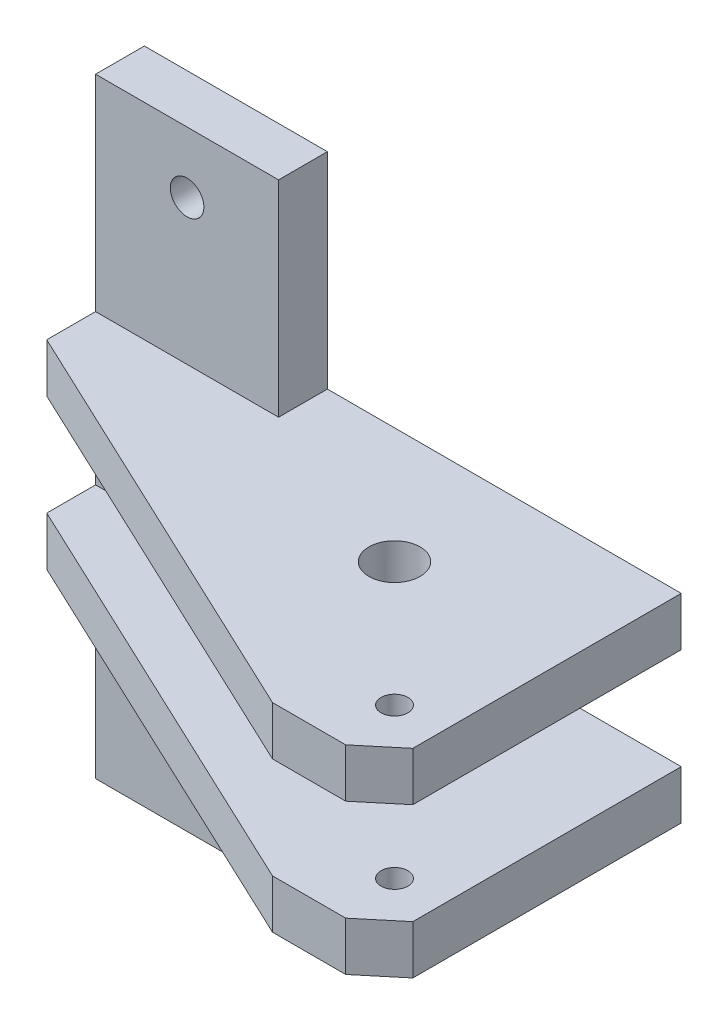
ISO-10303-21;
HEADER;
FILE_DESCRIPTION(('STEP AP214'),'2;1');
FILE_NAME('part.step','',(''),(''),'','','');
FILE_SCHEMA(('AUTOMOTIVE_DESIGN { 1 0 10303 214 1 1 1 1 }'));
ENDSEC;
DATA;
#1=APPLICATION_CONTEXT('core data for automotive mechanical design processes');
#2=APPLICATION_PROTOCOL_DEFINITION('international standard','automotive_design',2000,#1);
#3=PRODUCT_CONTEXT('',#1,'mechanical');
#4=PRODUCT('Part','Part','',(#3));
#5=PRODUCT_RELATED_PRODUCT_CATEGORY('part','',(#4));
#6=PRODUCT_DEFINITION_FORMATION('','',#4);
#7=PRODUCT_DEFINITION_CONTEXT('part definition',#1,'design');
#8=PRODUCT_DEFINITION('design','',#6,#7);
#9=PRODUCT_DEFINITION_SHAPE('','',#8);
#10=(LENGTH_UNIT() NAMED_UNIT(*) SI_UNIT(.MILLI.,.METRE.));
#11=(NAMED_UNIT(*) PLANE_ANGLE_UNIT() SI_UNIT($,.RADIAN.));
#12=(NAMED_UNIT(*) SI_UNIT($,.STERADIAN.) SOLID_ANGLE_UNIT());
#13=UNCERTAINTY_MEASURE_WITH_UNIT(LENGTH_MEASURE(1.E-05),#10,'distance_accuracy_value','');
#14=(GEOMETRIC_REPRESENTATION_CONTEXT(3) GLOBAL_UNCERTAINTY_ASSIGNED_CONTEXT((#13)) GLOBAL_UNIT_ASSIGNED_CONTEXT((#10,
#11,#12)) REPRESENTATION_CONTEXT('',''));
#15=CARTESIAN_POINT('',(0.,0.,0.));
#16=DIRECTION('',(0.,0.,1.));
#17=DIRECTION('',(1.,0.,0.));
#18=AXIS2_PLACEMENT_3D('',#15,#16,#17);
#19=CARTESIAN_POINT('',(30.,-8.3,19.));
#20=DIRECTION('',(0.,1.,0.));
#21=DIRECTION('',(0.,0.,1.));
#22=AXIS2_PLACEMENT_3D('',#19,#20,#21);
#23=CYLINDRICAL_SURFACE('',#22,5.5);
#24=CARTESIAN_POINT('',(30.,-8.3,19.));
#25=DIRECTION('',(0.,1.,0.));
#26=DIRECTION('',(0.,0.,1.));
#27=AXIS2_PLACEMENT_3D('',#24,#25,#26);
#28=CIRCLE('',#27,5.5);
#29=CARTESIAN_POINT('',(30.,-8.3,24.5));
#30=VERTEX_POINT('',#29);
#31=EDGE_CURVE('E291',#30,#30,#28,.T.);
#32=CARTESIAN_POINT('',(30.,-7.5,19.));
#33=DIRECTION('',(0.,1.,0.));
#34=DIRECTION('',(0.,0.,1.));
#35=AXIS2_PLACEMENT_3D('',#32,#33,#34);
#36=CIRCLE('',#35,5.5);
#37=CARTESIAN_POINT('',(30.,-7.5,24.5));
#38=VERTEX_POINT('',#37);
#39=EDGE_CURVE('E288',#38,#38,#36,.T.);
#40=CARTESIAN_POINT('',(30.,-8.3,24.5));
#41=CARTESIAN_POINT('',(30.,-8.29166666666667,24.5));
#42=CARTESIAN_POINT('',(30.,-8.28333333333333,24.5));
#43=CARTESIAN_POINT('',(30.,-8.26666666666667,24.5));
#44=CARTESIAN_POINT('',(30.,-8.25833333333333,24.5));
#45=CARTESIAN_POINT('',(30.,-8.24166666666667,24.5));
#46=CARTESIAN_POINT('',(30.,-8.23333333333333,24.5));
#47=CARTESIAN_POINT('',(30.,-8.21666666666667,24.5));
#48=CARTESIAN_POINT('',(30.,-8.20833333333334,24.5));
#49=CARTESIAN_POINT('',(30.,-8.19166666666667,24.5));
#50=CARTESIAN_POINT('',(30.,-8.18333333333333,24.5));
#51=CARTESIAN_POINT('',(30.,-8.16666666666667,24.5));
#52=CARTESIAN_POINT('',(30.,-8.15833333333333,24.5));
#53=CARTESIAN_POINT('',(30.,-8.14166666666667,24.5));
#54=CARTESIAN_POINT('',(30.,-8.13333333333333,24.5));
#55=CARTESIAN_POINT('',(30.,-8.11666666666667,24.5));
#56=CARTESIAN_POINT('',(30.,-8.10833333333333,24.5));
#57=CARTESIAN_POINT('',(30.,-8.09166666666667,24.5));
#58=CARTESIAN_POINT('',(30.,-8.08333333333333,24.5));
#59=CARTESIAN_POINT('',(30.,-8.06666666666667,24.5));
#60=CARTESIAN_POINT('',(30.,-8.05833333333333,24.5));
#61=CARTESIAN_POINT('',(30.,-8.04166666666667,24.5));
#62=CARTESIAN_POINT('',(30.,-8.03333333333333,24.5));
#63=CARTESIAN_POINT('',(30.,-8.01666666666667,24.5));
#64=CARTESIAN_POINT('',(30.,-8.00833333333333,24.5));
#65=CARTESIAN_POINT('',(30.,-7.99166666666667,24.5));
#66=CARTESIAN_POINT('',(30.,-7.98333333333333,24.5));
#67=CARTESIAN_POINT('',(30.,-7.96666666666667,24.5));
#68=CARTESIAN_POINT('',(30.,-7.95833333333333,24.5));
#69=CARTESIAN_POINT('',(30.,-7.94166666666667,24.5));
#70=CARTESIAN_POINT('',(30.,-7.93333333333333,24.5));
#71=CARTESIAN_POINT('',(30.,-7.91666666666667,24.5));
#72=CARTESIAN_POINT('',(30.,-7.90833333333333,24.5));
#73=CARTESIAN_POINT('',(30.,-7.89166666666667,24.5));
#74=CARTESIAN_POINT('',(30.,-7.88333333333333,24.5));
#75=CARTESIAN_POINT('',(30.,-7.86666666666667,24.5));
#76=CARTESIAN_POINT('',(30.,-7.85833333333333,24.5));
#77=CARTESIAN_POINT('',(30.,-7.84166666666667,24.5));
#78=CARTESIAN_POINT('',(30.,-7.83333333333333,24.5));
#79=CARTESIAN_POINT('',(30.,-7.81666666666667,24.5));
#80=CARTESIAN_POINT('',(30.,-7.80833333333333,24.5));
#81=CARTESIAN_POINT('',(30.,-7.79166666666667,24.5));
#82=CARTESIAN_POINT('',(30.,-7.78333333333333,24.5));
#83=CARTESIAN_POINT('',(30.,-7.76666666666667,24.5));
#84=CARTESIAN_POINT('',(30.,-7.75833333333333,24.5));
#85=CARTESIAN_POINT('',(30.,-7.74166666666667,24.5));
#86=CARTESIAN_POINT('',(30.,-7.73333333333333,24.5));
#87=CARTESIAN_POINT('',(30.,-7.71666666666667,24.5));
#88=CARTESIAN_POINT('',(30.,-7.70833333333333,24.5));
#89=CARTESIAN_POINT('',(30.,-7.69166666666667,24.5));
#90=CARTESIAN_POINT('',(30.,-7.68333333333333,24.5));
#91=CARTESIAN_POINT('',(30.,-7.66666666666667,24.5));
#92=CARTESIAN_POINT('',(30.,-7.65833333333333,24.5));
#93=CARTESIAN_POINT('',(30.,-7.64166666666667,24.5));
#94=CARTESIAN_POINT('',(30.,-7.63333333333333,24.5));
#95=CARTESIAN_POINT('',(30.,-7.61666666666667,24.5));
#96=CARTESIAN_POINT('',(30.,-7.60833333333333,24.5));
#97=CARTESIAN_POINT('',(30.,-7.59166666666667,24.5));
#98=CARTESIAN_POINT('',(30.,-7.58333333333333,24.5));
#99=CARTESIAN_POINT('',(30.,-7.56666666666667,24.5));
#100=CARTESIAN_POINT('',(30.,-7.55833333333333,24.5));
#101=CARTESIAN_POINT('',(30.,-7.54166666666667,24.5));
#102=CARTESIAN_POINT('',(30.,-7.53333333333333,24.5));
#103=CARTESIAN_POINT('',(30.,-7.51666666666667,24.5));
#104=CARTESIAN_POINT('',(30.,-7.50833333333333,24.5));
#105=CARTESIAN_POINT('',(30.,-7.5,24.5));
#106=B_SPLINE_CURVE_WITH_KNOTS('',3,(#40,#41,#42,#43,#44,#45,#46,#47,#48,#49,#50,#51,#52,#53,
#54,#55,#56,#57,#58,#59,#60,#61,#62,#63,#64,#65,#66,#67,#68,#69,#70,#71,#72,#73,#74,#75,#76,#77,
#78,#79,#80,#81,#82,#83,#84,#85,#86,#87,#88,#89,#90,#91,#92,#93,#94,#95,#96,#97,#98,#99,#100,
#101,#102,#103,#104,#105),.UNSPECIFIED.,.F.,.F.,(4,2,2,2,2,2,2,2,2,2,2,2,2,2,2,2,2,2,2,2,2,2,2,
2,2,2,2,2,2,2,2,2,4),(0.,0.024999999999999,0.0499999999999997,0.0749999999999987,
0.0999999999999994,0.124999999999998,0.149999999999999,0.175,0.199999999999999,0.225,
0.249999999999999,0.274999999999999,0.3,0.324999999999999,0.35,0.374999999999999,
0.399999999999999,0.425,0.449999999999999,0.475,0.5,0.524999999999999,0.549999999999999,
0.574999999999999,0.6,0.625,0.65,0.674999999999999,0.7,0.725,0.75,0.775,0.799999999999999),.UNSPECIFIED.);
#107=EDGE_CURVE('BSEAM39',#30,#38,#106,.T.);
#108=ORIENTED_EDGE('',*,*,#31,.T.);
#109=ORIENTED_EDGE('',*,*,#39,.F.);
#110=ORIENTED_EDGE('',*,*,#107,.T.);
#111=ORIENTED_EDGE('',*,*,#107,.F.);
#112=EDGE_LOOP('',(#108,#110,#109,#111));
#113=FACE_BOUND('',#112,.T.);
#114=ADVANCED_FACE('F39',(#113),#23,.T.);
#115=CARTESIAN_POINT('',(58.,-16.3,0.));
#116=DIRECTION('',(1.,0.,0.));
#117=DIRECTION('',(0.,0.,-1.));
#118=AXIS2_PLACEMENT_3D('',#115,#116,#117);
#119=PLANE('',#118);
#120=DIRECTION('',(0.,1.,0.));
#121=VECTOR('',#120,1.);
#122=CARTESIAN_POINT('',(58.,-16.3,44.));
#123=LINE('',#122,#121);
#124=CARTESIAN_POINT('',(58.,8.3,44.));
#125=VERTEX_POINT('',#124);
#126=CARTESIAN_POINT('',(58.,16.3,44.));
#127=VERTEX_POINT('',#126);
#128=EDGE_CURVE('E370',#125,#127,#123,.T.);
#129=ORIENTED_EDGE('',*,*,#128,.F.);
#130=DIRECTION('',(0.,0.,-1.));
#131=VECTOR('',#130,1.);
#132=CARTESIAN_POINT('',(58.,8.3,0.));
#133=LINE('',#132,#131);
#134=CARTESIAN_POINT('',(58.,8.3,0.));
#135=VERTEX_POINT('',#134);
#136=EDGE_CURVE('E317',#125,#135,#133,.T.);
#137=ORIENTED_EDGE('',*,*,#136,.T.);
#138=DIRECTION('',(0.,1.,0.));
#139=VECTOR('',#138,1.);
#140=CARTESIAN_POINT('',(58.,-16.3,0.));
#141=LINE('',#140,#139);
#142=CARTESIAN_POINT('',(58.,16.3,0.));
#143=VERTEX_POINT('',#142);
#144=EDGE_CURVE('E367',#135,#143,#141,.T.);
#145=ORIENTED_EDGE('',*,*,#144,.T.);
#146=DIRECTION('',(0.,0.,-1.));
#147=VECTOR('',#146,1.);
#148=CARTESIAN_POINT('',(58.,16.3,0.));
#149=LINE('',#148,#147);
#150=EDGE_CURVE('E360',#127,#143,#149,.T.);
#151=ORIENTED_EDGE('',*,*,#150,.F.);
#152=EDGE_LOOP('',(#129,#137,#145,#151));
#153=FACE_BOUND('',#152,.T.);
#154=ADVANCED_FACE('F407',(#153),#119,.T.);
#155=CARTESIAN_POINT('',(58.,-16.3,44.));
#156=DIRECTION('',(0.64018439966448,0.,0.768221279597376));
#157=DIRECTION('',(0.768221279597376,0.,-0.64018439966448));
#158=AXIS2_PLACEMENT_3D('',#155,#156,#157);
#159=PLANE('',#158);
#160=DIRECTION('',(0.,1.,0.));
#161=VECTOR('',#160,1.);
#162=CARTESIAN_POINT('',(52.,-16.3,49.));
#163=LINE('',#162,#161);
#164=CARTESIAN_POINT('',(52.,8.3,49.));
#165=VERTEX_POINT('',#164);
#166=CARTESIAN_POINT('',(52.,16.3,49.));
#167=VERTEX_POINT('',#166);
#168=EDGE_CURVE('E373',#165,#167,#163,.T.);
#169=ORIENTED_EDGE('',*,*,#168,.F.);
#170=DIRECTION('',(0.768221279597376,0.,-0.64018439966448));
#171=VECTOR('',#170,1.);
#172=CARTESIAN_POINT('',(58.,8.3,44.));
#173=LINE('',#172,#171);
#174=EDGE_CURVE('E314',#165,#125,#173,.T.);
#175=ORIENTED_EDGE('',*,*,#174,.T.);
#176=ORIENTED_EDGE('',*,*,#128,.T.);
#177=DIRECTION('',(0.768221279597376,0.,-0.64018439966448));
#178=VECTOR('',#177,1.);
#179=CARTESIAN_POINT('',(58.,16.3,44.));
#180=LINE('',#179,#178);
#181=EDGE_CURVE('E357',#167,#127,#180,.T.);
#182=ORIENTED_EDGE('',*,*,#181,.F.);
#183=EDGE_LOOP('',(#169,#175,#176,#182));
#184=FACE_BOUND('',#183,.T.);
#185=ADVANCED_FACE('F382',(#184),#159,.T.);
#186=CARTESIAN_POINT('',(52.,-16.3,49.));
#187=DIRECTION('',(0.,0.,1.));
#188=DIRECTION('',(1.,0.,0.));
#189=AXIS2_PLACEMENT_3D('',#186,#187,#188);
#190=PLANE('',#189);
#191=DIRECTION('',(0.,1.,0.));
#192=VECTOR('',#191,1.);
#193=CARTESIAN_POINT('',(40.,-16.3,49.));
#194=LINE('',#193,#192);
#195=CARTESIAN_POINT('',(40.,8.3,49.));
#196=VERTEX_POINT('',#195);
#197=CARTESIAN_POINT('',(40.,16.3,49.));
#198=VERTEX_POINT('',#197);
#199=EDGE_CURVE('E204',#196,#198,#194,.T.);
#200=ORIENTED_EDGE('',*,*,#199,.F.);
#201=DIRECTION('',(1.,0.,0.));
#202=VECTOR('',#201,1.);
#203=CARTESIAN_POINT('',(52.,8.3,49.));
#204=LINE('',#203,#202);
#205=EDGE_CURVE('E56',#196,#165,#204,.T.);
#206=ORIENTED_EDGE('',*,*,#205,.T.);
#207=ORIENTED_EDGE('',*,*,#168,.T.);
#208=DIRECTION('',(1.,0.,0.));
#209=VECTOR('',#208,1.);
#210=CARTESIAN_POINT('',(52.,16.3,49.));
#211=LINE('',#210,#209);
#212=EDGE_CURVE('E354',#198,#167,#211,.T.);
#213=ORIENTED_EDGE('',*,*,#212,.F.);
#214=EDGE_LOOP('',(#200,#206,#207,#213));
#215=FACE_BOUND('',#214,.T.);
#216=ADVANCED_FACE('F380',(#215),#190,.T.);
#217=CARTESIAN_POINT('',(40.,-16.3,49.));
#218=DIRECTION('',(-0.426419231698256,0.,0.9045256429963));
#219=DIRECTION('',(0.9045256429963,0.,0.426419231698256));
#220=AXIS2_PLACEMENT_3D('',#217,#218,#219);
#221=PLANE('',#220);
#222=DIRECTION('',(0.,1.,0.));
#223=VECTOR('',#222,1.);
#224=CARTESIAN_POINT('',(-30.,-16.3,16.));
#225=LINE('',#224,#223);
#226=CARTESIAN_POINT('',(-30.,8.3,16.));
#227=VERTEX_POINT('',#226);
#228=CARTESIAN_POINT('',(-30.,16.3,16.));
#229=VERTEX_POINT('',#228);
#230=EDGE_CURVE('E205',#227,#229,#225,.T.);
#231=ORIENTED_EDGE('',*,*,#230,.F.);
#232=DIRECTION('',(0.9045256429963,0.,0.426419231698256));
#233=VECTOR('',#232,1.);
#234=CARTESIAN_POINT('',(40.,8.3,49.));
#235=LINE('',#234,#233);
#236=EDGE_CURVE('E311',#227,#196,#235,.T.);
#237=ORIENTED_EDGE('',*,*,#236,.T.);
#238=ORIENTED_EDGE('',*,*,#199,.T.);
#239=DIRECTION('',(0.9045256429963,0.,0.426419231698256));
#240=VECTOR('',#239,1.);
#241=CARTESIAN_POINT('',(40.,16.3,49.));
#242=LINE('',#241,#240);
#243=EDGE_CURVE('E351',#229,#198,#242,.T.);
#244=ORIENTED_EDGE('',*,*,#243,.F.);
#245=EDGE_LOOP('',(#231,#237,#238,#244));
#246=FACE_BOUND('',#245,.T.);
#247=ADVANCED_FACE('F391',(#246),#221,.T.);
#248=CARTESIAN_POINT('',(0.,0.,8.));
#249=DIRECTION('',(0.,0.,-1.));
#250=DIRECTION('',(-1.,0.,0.));
#251=AXIS2_PLACEMENT_3D('',#248,#249,#250);
#252=PLANE('',#251);
#253=CARTESIAN_POINT('',(-15.,40.,8.));
#254=DIRECTION('',(0.,0.,1.));
#255=DIRECTION('',(1.,0.,0.));
#256=AXIS2_PLACEMENT_3D('',#253,#254,#255);
#257=CIRCLE('',#256,2.75);
#258=CARTESIAN_POINT('',(-12.25,40.,8.));
#259=VERTEX_POINT('',#258);
#260=EDGE_CURVE('E217',#259,#259,#257,.T.);
#261=ORIENTED_EDGE('',*,*,#260,.F.);
#262=EDGE_LOOP('',(#261));
#263=FACE_BOUND('',#262,.T.);
#264=DIRECTION('',(-1.,0.,0.));
#265=VECTOR('',#264,1.);
#266=CARTESIAN_POINT('',(0.,16.3,8.));
#267=LINE('',#266,#265);
#268=CARTESIAN_POINT('',(0.,16.3,8.));
#269=VERTEX_POINT('',#268);
#270=CARTESIAN_POINT('',(-30.,16.3,8.));
#271=VERTEX_POINT('',#270);
#272=EDGE_CURVE('E211',#269,#271,#267,.T.);
#273=ORIENTED_EDGE('',*,*,#272,.F.);
#274=DIRECTION('',(0.,1.,0.));
#275=VECTOR('',#274,1.);
#276=CARTESIAN_POINT('',(0.,-50.,8.));
#277=LINE('',#276,#275);
#278=CARTESIAN_POINT('',(0.,50.,8.));
#279=VERTEX_POINT('',#278);
#280=EDGE_CURVE('E234',#269,#279,#277,.T.);
#281=ORIENTED_EDGE('',*,*,#280,.T.);
#282=DIRECTION('',(-1.,0.,0.));
#283=VECTOR('',#282,1.);
#284=CARTESIAN_POINT('',(-30.,50.,8.));
#285=LINE('',#284,#283);
#286=CARTESIAN_POINT('',(-30.,50.,8.));
#287=VERTEX_POINT('',#286);
#288=EDGE_CURVE('E237',#279,#287,#285,.T.);
#289=ORIENTED_EDGE('',*,*,#288,.T.);
#290=DIRECTION('',(0.,-1.,0.));
#291=VECTOR('',#290,1.);
#292=CARTESIAN_POINT('',(-30.,-50.,8.));
#293=LINE('',#292,#291);
#294=EDGE_CURVE('E229',#287,#271,#293,.T.);
#295=ORIENTED_EDGE('',*,*,#294,.T.);
#296=EDGE_LOOP('',(#273,#281,#289,#295));
#297=FACE_BOUND('',#296,.T.);
#298=ADVANCED_FACE('F422',(#263,#297),#252,.F.);
#299=CARTESIAN_POINT('',(0.,-50.,8.));
#300=DIRECTION('',(-1.,0.,0.));
#301=DIRECTION('',(0.,0.,1.));
#302=AXIS2_PLACEMENT_3D('',#299,#300,#301);
#303=PLANE('',#302);
#304=DIRECTION('',(0.,0.,1.));
#305=VECTOR('',#304,1.);
#306=CARTESIAN_POINT('',(0.,16.3,8.));
#307=LINE('',#306,#305);
#308=CARTESIAN_POINT('',(0.,16.3,0.));
#309=VERTEX_POINT('',#308);
#310=EDGE_CURVE('E259',#309,#269,#307,.T.);
#311=ORIENTED_EDGE('',*,*,#310,.F.);
#312=DIRECTION('',(0.,1.,0.));
#313=VECTOR('',#312,1.);
#314=CARTESIAN_POINT('',(0.,-50.,0.));
#315=LINE('',#314,#313);
#316=CARTESIAN_POINT('',(0.,50.,0.));
#317=VERTEX_POINT('',#316);
#318=EDGE_CURVE('E243',#309,#317,#315,.T.);
#319=ORIENTED_EDGE('',*,*,#318,.T.);
#320=DIRECTION('',(0.,0.,-1.));
#321=VECTOR('',#320,1.);
#322=CARTESIAN_POINT('',(0.,50.,8.));
#323=LINE('',#322,#321);
#324=EDGE_CURVE('E250',#279,#317,#323,.T.);
#325=ORIENTED_EDGE('',*,*,#324,.F.);
#326=ORIENTED_EDGE('',*,*,#280,.F.);
#327=EDGE_LOOP('',(#311,#319,#325,#326));
#328=FACE_BOUND('',#327,.T.);
#329=ADVANCED_FACE('F410',(#328),#303,.F.);
#330=CARTESIAN_POINT('',(0.,-50.,8.));
#331=VERTEX_POINT('',#330);
#332=CARTESIAN_POINT('',(0.,-16.3,8.));
#333=VERTEX_POINT('',#332);
#334=EDGE_CURVE('E235',#331,#333,#277,.T.);
#335=ORIENTED_EDGE('',*,*,#334,.T.);
#336=DIRECTION('',(-1.,0.,0.));
#337=VECTOR('',#336,1.);
#338=CARTESIAN_POINT('',(0.,-16.3,8.));
#339=LINE('',#338,#337);
#340=CARTESIAN_POINT('',(-30.,-16.3,8.));
#341=VERTEX_POINT('',#340);
#342=EDGE_CURVE('E64',#333,#341,#339,.T.);
#343=ORIENTED_EDGE('',*,*,#342,.T.);
#344=CARTESIAN_POINT('',(-30.,-50.,8.));
#345=VERTEX_POINT('',#344);
#346=EDGE_CURVE('E232',#341,#345,#293,.T.);
#347=ORIENTED_EDGE('',*,*,#346,.T.);
#348=DIRECTION('',(1.,0.,0.));
#349=VECTOR('',#348,1.);
#350=CARTESIAN_POINT('',(-30.,-50.,8.));
#351=LINE('',#350,#349);
#352=EDGE_CURVE('E231',#345,#331,#351,.T.);
#353=ORIENTED_EDGE('',*,*,#352,.T.);
#354=EDGE_LOOP('',(#335,#343,#347,#353));
#355=FACE_BOUND('',#354,.T.);
#356=CARTESIAN_POINT('',(-15.,-40.,8.));
#357=DIRECTION('',(0.,0.,1.));
#358=DIRECTION('',(1.,0.,0.));
#359=AXIS2_PLACEMENT_3D('',#356,#357,#358);
#360=CIRCLE('',#359,2.75);
#361=CARTESIAN_POINT('',(-12.25,-40.,8.));
#362=VERTEX_POINT('',#361);
#363=EDGE_CURVE('E223',#362,#362,#360,.T.);
#364=ORIENTED_EDGE('',*,*,#363,.F.);
#365=EDGE_LOOP('',(#364));
#366=FACE_BOUND('',#365,.T.);
#367=ADVANCED_FACE('F426',(#355,#366),#252,.F.);
#368=CARTESIAN_POINT('',(0.,0.,0.));
#369=DIRECTION('',(0.,0.,-1.));
#370=DIRECTION('',(-1.,0.,0.));
#371=AXIS2_PLACEMENT_3D('',#368,#369,#370);
#372=PLANE('',#371);
#373=DIRECTION('',(-1.,0.,0.));
#374=VECTOR('',#373,1.);
#375=CARTESIAN_POINT('',(0.,-8.3,0.));
#376=LINE('',#375,#374);
#377=CARTESIAN_POINT('',(58.,-8.3,0.));
#378=VERTEX_POINT('',#377);
#379=CARTESIAN_POINT('',(0.,-8.3,0.));
#380=VERTEX_POINT('',#379);
#381=EDGE_CURVE('E302',#378,#380,#376,.T.);
#382=ORIENTED_EDGE('',*,*,#381,.F.);
#383=CARTESIAN_POINT('',(58.,-16.3,0.));
#384=VERTEX_POINT('',#383);
#385=EDGE_CURVE('E214',#384,#378,#141,.T.);
#386=ORIENTED_EDGE('',*,*,#385,.F.);
#387=DIRECTION('',(-1.,0.,0.));
#388=VECTOR('',#387,1.);
#389=CARTESIAN_POINT('',(-30.,-16.3,0.));
#390=LINE('',#389,#388);
#391=CARTESIAN_POINT('',(0.,-16.3,0.));
#392=VERTEX_POINT('',#391);
#393=EDGE_CURVE('E208',#384,#392,#390,.T.);
#394=ORIENTED_EDGE('',*,*,#393,.T.);
#395=CARTESIAN_POINT('',(0.,-50.,0.));
#396=VERTEX_POINT('',#395);
#397=EDGE_CURVE('E244',#396,#392,#315,.T.);
#398=ORIENTED_EDGE('',*,*,#397,.F.);
#399=DIRECTION('',(1.,0.,0.));
#400=VECTOR('',#399,1.);
#401=CARTESIAN_POINT('',(-30.,-50.,0.));
#402=LINE('',#401,#400);
#403=CARTESIAN_POINT('',(-30.,-50.,0.));
#404=VERTEX_POINT('',#403);
#405=EDGE_CURVE('E241',#404,#396,#402,.T.);
#406=ORIENTED_EDGE('',*,*,#405,.F.);
#407=DIRECTION('',(0.,-1.,0.));
#408=VECTOR('',#407,1.);
#409=CARTESIAN_POINT('',(-30.,-50.,0.));
#410=LINE('',#409,#408);
#411=CARTESIAN_POINT('',(-30.,50.,0.));
#412=VERTEX_POINT('',#411);
#413=EDGE_CURVE('E226',#412,#404,#410,.T.);
#414=ORIENTED_EDGE('',*,*,#413,.F.);
#415=DIRECTION('',(-1.,0.,0.));
#416=VECTOR('',#415,1.);
#417=CARTESIAN_POINT('',(-30.,50.,0.));
#418=LINE('',#417,#416);
#419=EDGE_CURVE('E246',#317,#412,#418,.T.);
#420=ORIENTED_EDGE('',*,*,#419,.F.);
#421=ORIENTED_EDGE('',*,*,#318,.F.);
#422=DIRECTION('',(-1.,0.,0.));
#423=VECTOR('',#422,1.);
#424=CARTESIAN_POINT('',(-30.,16.3,0.));
#425=LINE('',#424,#423);
#426=EDGE_CURVE('E336',#143,#309,#425,.T.);
#427=ORIENTED_EDGE('',*,*,#426,.F.);
#428=ORIENTED_EDGE('',*,*,#144,.F.);
#429=DIRECTION('',(-1.,0.,0.));
#430=VECTOR('',#429,1.);
#431=CARTESIAN_POINT('',(0.,8.3,0.));
#432=LINE('',#431,#430);
#433=CARTESIAN_POINT('',(0.,8.3,0.));
#434=VERTEX_POINT('',#433);
#435=EDGE_CURVE('E320',#135,#434,#432,.T.);
#436=ORIENTED_EDGE('',*,*,#435,.T.);
#437=DIRECTION('',(0.,1.,0.));
#438=VECTOR('',#437,1.);
#439=CARTESIAN_POINT('',(0.,-8.3,0.));
#440=LINE('',#439,#438);
#441=EDGE_CURVE('E308',#380,#434,#440,.T.);
#442=ORIENTED_EDGE('',*,*,#441,.F.);
#443=EDGE_LOOP('',(#382,#386,#394,#398,#406,#414,#420,#421,#427,#428,#436,#442));
#444=FACE_BOUND('',#443,.T.);
#445=CARTESIAN_POINT('',(-15.,-40.,0.));
#446=DIRECTION('',(0.,0.,1.));
#447=DIRECTION('',(1.,0.,0.));
#448=AXIS2_PLACEMENT_3D('',#445,#446,#447);
#449=CIRCLE('',#448,2.75);
#450=CARTESIAN_POINT('',(-12.25,-40.,0.));
#451=VERTEX_POINT('',#450);
#452=EDGE_CURVE('E220',#451,#451,#449,.T.);
#453=ORIENTED_EDGE('',*,*,#452,.T.);
#454=EDGE_LOOP('',(#453));
#455=FACE_BOUND('',#454,.T.);
#456=CARTESIAN_POINT('',(-15.,40.,0.));
#457=DIRECTION('',(0.,0.,1.));
#458=DIRECTION('',(1.,0.,0.));
#459=AXIS2_PLACEMENT_3D('',#456,#457,#458);
#460=CIRCLE('',#459,2.75);
#461=CARTESIAN_POINT('',(-12.25,40.,0.));
#462=VERTEX_POINT('',#461);
#463=EDGE_CURVE('E216',#462,#462,#460,.T.);
#464=ORIENTED_EDGE('',*,*,#463,.T.);
#465=EDGE_LOOP('',(#464));
#466=FACE_BOUND('',#465,.T.);
#467=ADVANCED_FACE('F402',(#444,#455,#466),#372,.T.);
#468=CARTESIAN_POINT('',(-30.,-50.,8.));
#469=DIRECTION('',(1.,0.,0.));
#470=DIRECTION('',(0.,0.,-1.));
#471=AXIS2_PLACEMENT_3D('',#468,#469,#470);
#472=PLANE('',#471);
#473=CARTESIAN_POINT('',(-30.,-16.3,16.));
#474=VERTEX_POINT('',#473);
#475=CARTESIAN_POINT('',(-30.,-8.3,16.));
#476=VERTEX_POINT('',#475);
#477=EDGE_CURVE('E197',#474,#476,#225,.T.);
#478=ORIENTED_EDGE('',*,*,#477,.T.);
#479=DIRECTION('',(0.,0.,1.));
#480=VECTOR('',#479,1.);
#481=CARTESIAN_POINT('',(-30.,-8.3,16.));
#482=LINE('',#481,#480);
#483=CARTESIAN_POINT('',(-30.,-8.3,8.));
#484=VERTEX_POINT('',#483);
#485=EDGE_CURVE('E179',#484,#476,#482,.T.);
#486=ORIENTED_EDGE('',*,*,#485,.F.);
#487=DIRECTION('',(0.,1.,0.));
#488=VECTOR('',#487,1.);
#489=CARTESIAN_POINT('',(-30.,-8.3,8.));
#490=LINE('',#489,#488);
#491=CARTESIAN_POINT('',(-30.,8.3,8.));
#492=VERTEX_POINT('',#491);
#493=EDGE_CURVE('E328',#484,#492,#490,.T.);
#494=ORIENTED_EDGE('',*,*,#493,.T.);
#495=DIRECTION('',(0.,0.,1.));
#496=VECTOR('',#495,1.);
#497=CARTESIAN_POINT('',(-30.,8.3,16.));
#498=LINE('',#497,#496);
#499=EDGE_CURVE('E295',#492,#227,#498,.T.);
#500=ORIENTED_EDGE('',*,*,#499,.T.);
#501=ORIENTED_EDGE('',*,*,#230,.T.);
#502=DIRECTION('',(0.,0.,1.));
#503=VECTOR('',#502,1.);
#504=CARTESIAN_POINT('',(-30.,16.3,16.));
#505=LINE('',#504,#503);
#506=EDGE_CURVE('E330',#271,#229,#505,.T.);
#507=ORIENTED_EDGE('',*,*,#506,.F.);
#508=ORIENTED_EDGE('',*,*,#294,.F.);
#509=DIRECTION('',(0.,0.,-1.));
#510=VECTOR('',#509,1.);
#511=CARTESIAN_POINT('',(-30.,50.,8.));
#512=LINE('',#511,#510);
#513=EDGE_CURVE('E239',#287,#412,#512,.T.);
#514=ORIENTED_EDGE('',*,*,#513,.T.);
#515=ORIENTED_EDGE('',*,*,#413,.T.);
#516=DIRECTION('',(0.,0.,-1.));
#517=VECTOR('',#516,1.);
#518=CARTESIAN_POINT('',(-30.,-50.,8.));
#519=LINE('',#518,#517);
#520=EDGE_CURVE('E256',#345,#404,#519,.T.);
#521=ORIENTED_EDGE('',*,*,#520,.F.);
#522=ORIENTED_EDGE('',*,*,#346,.F.);
#523=DIRECTION('',(0.,0.,1.));
#524=VECTOR('',#523,1.);
#525=CARTESIAN_POINT('',(-30.,-16.3,16.));
#526=LINE('',#525,#524);
#527=EDGE_CURVE('E203',#341,#474,#526,.T.);
#528=ORIENTED_EDGE('',*,*,#527,.T.);
#529=EDGE_LOOP('',(#478,#486,#494,#500,#501,#507,#508,#514,#515,#521,#522,#528));
#530=FACE_BOUND('',#529,.T.);
#531=ADVANCED_FACE('F41',(#530),#472,.F.);
#532=CARTESIAN_POINT('',(-30.,-50.,8.));
#533=DIRECTION('',(0.,1.,0.));
#534=DIRECTION('',(0.,0.,1.));
#535=AXIS2_PLACEMENT_3D('',#532,#533,#534);
#536=PLANE('',#535);
#537=ORIENTED_EDGE('',*,*,#405,.T.);
#538=DIRECTION('',(0.,0.,-1.));
#539=VECTOR('',#538,1.);
#540=CARTESIAN_POINT('',(0.,-50.,8.));
#541=LINE('',#540,#539);
#542=EDGE_CURVE('E253',#331,#396,#541,.T.);
#543=ORIENTED_EDGE('',*,*,#542,.F.);
#544=ORIENTED_EDGE('',*,*,#352,.F.);
#545=ORIENTED_EDGE('',*,*,#520,.T.);
#546=EDGE_LOOP('',(#537,#543,#544,#545));
#547=FACE_BOUND('',#546,.T.);
#548=ADVANCED_FACE('F513',(#547),#536,.F.);
#549=ORIENTED_EDGE('',*,*,#397,.T.);
#550=DIRECTION('',(0.,0.,1.));
#551=VECTOR('',#550,1.);
#552=CARTESIAN_POINT('',(0.,-16.3,8.));
#553=LINE('',#552,#551);
#554=EDGE_CURVE('E48',#392,#333,#553,.T.);
#555=ORIENTED_EDGE('',*,*,#554,.T.);
#556=ORIENTED_EDGE('',*,*,#334,.F.);
#557=ORIENTED_EDGE('',*,*,#542,.T.);
#558=EDGE_LOOP('',(#549,#555,#556,#557));
#559=FACE_BOUND('',#558,.T.);
#560=ADVANCED_FACE('F432',(#559),#303,.F.);
#561=CARTESIAN_POINT('',(-30.,50.,8.));
#562=DIRECTION('',(0.,-1.,0.));
#563=DIRECTION('',(0.,0.,-1.));
#564=AXIS2_PLACEMENT_3D('',#561,#562,#563);
#565=PLANE('',#564);
#566=ORIENTED_EDGE('',*,*,#419,.T.);
#567=ORIENTED_EDGE('',*,*,#513,.F.);
#568=ORIENTED_EDGE('',*,*,#288,.F.);
#569=ORIENTED_EDGE('',*,*,#324,.T.);
#570=EDGE_LOOP('',(#566,#567,#568,#569));
#571=FACE_BOUND('',#570,.T.);
#572=ADVANCED_FACE('F417',(#571),#565,.F.);
#573=CARTESIAN_POINT('',(-15.,-40.,8.));
#574=DIRECTION('',(0.,0.,-1.));
#575=DIRECTION('',(-1.,0.,0.));
#576=AXIS2_PLACEMENT_3D('',#573,#574,#575);
#577=CYLINDRICAL_SURFACE('',#576,2.75);
#578=ORIENTED_EDGE('',*,*,#363,.T.);
#579=EDGE_LOOP('',(#578));
#580=FACE_BOUND('',#579,.T.);
#581=ORIENTED_EDGE('',*,*,#452,.F.);
#582=EDGE_LOOP('',(#581));
#583=FACE_BOUND('',#582,.T.);
#584=ADVANCED_FACE('F495',(#580,#583),#577,.F.);
#585=CARTESIAN_POINT('',(-15.,40.,8.));
#586=DIRECTION('',(0.,0.,-1.));
#587=DIRECTION('',(-1.,0.,0.));
#588=AXIS2_PLACEMENT_3D('',#585,#586,#587);
#589=CYLINDRICAL_SURFACE('',#588,2.75);
#590=ORIENTED_EDGE('',*,*,#260,.T.);
#591=EDGE_LOOP('',(#590));
#592=FACE_BOUND('',#591,.T.);
#593=ORIENTED_EDGE('',*,*,#463,.F.);
#594=EDGE_LOOP('',(#593));
#595=FACE_BOUND('',#594,.T.);
#596=ADVANCED_FACE('F479',(#592,#595),#589,.F.);
#597=CARTESIAN_POINT('',(0.,-16.3,0.));
#598=DIRECTION('',(0.,-1.,0.));
#599=DIRECTION('',(0.,0.,-1.));
#600=AXIS2_PLACEMENT_3D('',#597,#598,#599);
#601=PLANE('',#600);
#602=CARTESIAN_POINT('',(30.,-16.3,19.));
#603=DIRECTION('',(0.,-1.,0.));
#604=DIRECTION('',(0.,0.,-1.));
#605=AXIS2_PLACEMENT_3D('',#602,#603,#604);
#606=CIRCLE('',#605,4.2);
#607=CARTESIAN_POINT('',(30.,-16.3,14.8));
#608=VERTEX_POINT('',#607);
#609=EDGE_CURVE('E273',#608,#608,#606,.T.);
#610=ORIENTED_EDGE('',*,*,#609,.F.);
#611=EDGE_LOOP('',(#610));
#612=FACE_BOUND('',#611,.T.);
#613=CARTESIAN_POINT('',(50.3646752981726,-16.3,39.3646752981726));
#614=DIRECTION('',(0.,-1.,0.));
#615=DIRECTION('',(0.,0.,-1.));
#616=AXIS2_PLACEMENT_3D('',#613,#614,#615);
#617=CIRCLE('',#616,2.2);
#618=CARTESIAN_POINT('',(50.3646752981726,-16.3,37.1646752981726));
#619=VERTEX_POINT('',#618);
#620=EDGE_CURVE('E284',#619,#619,#617,.T.);
#621=ORIENTED_EDGE('',*,*,#620,.F.);
#622=EDGE_LOOP('',(#621));
#623=FACE_BOUND('',#622,.T.);
#624=ORIENTED_EDGE('',*,*,#342,.F.);
#625=ORIENTED_EDGE('',*,*,#554,.F.);
#626=ORIENTED_EDGE('',*,*,#393,.F.);
#627=DIRECTION('',(0.,0.,-1.));
#628=VECTOR('',#627,1.);
#629=CARTESIAN_POINT('',(58.,-16.3,0.));
#630=LINE('',#629,#628);
#631=CARTESIAN_POINT('',(58.,-16.3,44.));
#632=VERTEX_POINT('',#631);
#633=EDGE_CURVE('E344',#632,#384,#630,.T.);
#634=ORIENTED_EDGE('',*,*,#633,.F.);
#635=DIRECTION('',(0.768221279597376,0.,-0.64018439966448));
#636=VECTOR('',#635,1.);
#637=CARTESIAN_POINT('',(58.,-16.3,44.));
#638=LINE('',#637,#636);
#639=CARTESIAN_POINT('',(52.,-16.3,49.));
#640=VERTEX_POINT('',#639);
#641=EDGE_CURVE('E341',#640,#632,#638,.T.);
#642=ORIENTED_EDGE('',*,*,#641,.F.);
#643=DIRECTION('',(1.,0.,0.));
#644=VECTOR('',#643,1.);
#645=CARTESIAN_POINT('',(52.,-16.3,49.));
#646=LINE('',#645,#644);
#647=CARTESIAN_POINT('',(40.,-16.3,49.));
#648=VERTEX_POINT('',#647);
#649=EDGE_CURVE('E338',#648,#640,#646,.T.);
#650=ORIENTED_EDGE('',*,*,#649,.F.);
#651=DIRECTION('',(0.9045256429963,0.,0.426419231698256));
#652=VECTOR('',#651,1.);
#653=CARTESIAN_POINT('',(40.,-16.3,49.));
#654=LINE('',#653,#652);
#655=EDGE_CURVE('E335',#474,#648,#654,.T.);
#656=ORIENTED_EDGE('',*,*,#655,.F.);
#657=ORIENTED_EDGE('',*,*,#527,.F.);
#658=EDGE_LOOP('',(#624,#625,#626,#634,#642,#650,#656,#657));
#659=FACE_BOUND('',#658,.T.);
#660=ADVANCED_FACE('F476',(#612,#623,#659),#601,.T.);
#661=CARTESIAN_POINT('',(0.,16.3,0.));
#662=DIRECTION('',(0.,-1.,0.));
#663=DIRECTION('',(0.,0.,-1.));
#664=AXIS2_PLACEMENT_3D('',#661,#662,#663);
#665=PLANE('',#664);
#666=CARTESIAN_POINT('',(30.,16.3,19.));
#667=DIRECTION('',(0.,-1.,0.));
#668=DIRECTION('',(0.,0.,-1.));
#669=AXIS2_PLACEMENT_3D('',#666,#667,#668);
#670=CIRCLE('',#669,4.2);
#671=CARTESIAN_POINT('',(30.,16.3,14.8));
#672=VERTEX_POINT('',#671);
#673=EDGE_CURVE('E268',#672,#672,#670,.T.);
#674=ORIENTED_EDGE('',*,*,#673,.T.);
#675=EDGE_LOOP('',(#674));
#676=FACE_BOUND('',#675,.T.);
#677=CARTESIAN_POINT('',(50.3646752981726,16.3,39.3646752981726));
#678=DIRECTION('',(0.,-1.,0.));
#679=DIRECTION('',(0.,0.,-1.));
#680=AXIS2_PLACEMENT_3D('',#677,#678,#679);
#681=CIRCLE('',#680,2.2);
#682=CARTESIAN_POINT('',(50.3646752981726,16.3,37.1646752981726));
#683=VERTEX_POINT('',#682);
#684=EDGE_CURVE('E281',#683,#683,#681,.T.);
#685=ORIENTED_EDGE('',*,*,#684,.T.);
#686=EDGE_LOOP('',(#685));
#687=FACE_BOUND('',#686,.T.);
#688=ORIENTED_EDGE('',*,*,#310,.T.);
#689=ORIENTED_EDGE('',*,*,#272,.T.);
#690=ORIENTED_EDGE('',*,*,#506,.T.);
#691=ORIENTED_EDGE('',*,*,#243,.T.);
#692=ORIENTED_EDGE('',*,*,#212,.T.);
#693=ORIENTED_EDGE('',*,*,#181,.T.);
#694=ORIENTED_EDGE('',*,*,#150,.T.);
#695=ORIENTED_EDGE('',*,*,#426,.T.);
#696=EDGE_LOOP('',(#688,#689,#690,#691,#692,#693,#694,#695));
#697=FACE_BOUND('',#696,.T.);
#698=ADVANCED_FACE('F386',(#676,#687,#697),#665,.F.);
#699=DIRECTION('',(0.,0.,-1.));
#700=VECTOR('',#699,1.);
#701=CARTESIAN_POINT('',(58.,-8.3,0.));
#702=LINE('',#701,#700);
#703=CARTESIAN_POINT('',(58.,-8.3,44.));
#704=VERTEX_POINT('',#703);
#705=EDGE_CURVE('E300',#704,#378,#702,.T.);
#706=ORIENTED_EDGE('',*,*,#705,.F.);
#707=EDGE_CURVE('E368',#632,#704,#123,.T.);
#708=ORIENTED_EDGE('',*,*,#707,.F.);
#709=ORIENTED_EDGE('',*,*,#633,.T.);
#710=ORIENTED_EDGE('',*,*,#385,.T.);
#711=EDGE_LOOP('',(#706,#708,#709,#710));
#712=FACE_BOUND('',#711,.T.);
#713=ADVANCED_FACE('F446',(#712),#119,.T.);
#714=DIRECTION('',(0.768221279597376,0.,-0.64018439966448));
#715=VECTOR('',#714,1.);
#716=CARTESIAN_POINT('',(58.,-8.3,44.));
#717=LINE('',#716,#715);
#718=CARTESIAN_POINT('',(52.,-8.3,49.));
#719=VERTEX_POINT('',#718);
#720=EDGE_CURVE('E298',#719,#704,#717,.T.);
#721=ORIENTED_EDGE('',*,*,#720,.F.);
#722=EDGE_CURVE('E371',#640,#719,#163,.T.);
#723=ORIENTED_EDGE('',*,*,#722,.F.);
#724=ORIENTED_EDGE('',*,*,#641,.T.);
#725=ORIENTED_EDGE('',*,*,#707,.T.);
#726=EDGE_LOOP('',(#721,#723,#724,#725));
#727=FACE_BOUND('',#726,.T.);
#728=ADVANCED_FACE('F485',(#727),#159,.T.);
#729=DIRECTION('',(1.,0.,0.));
#730=VECTOR('',#729,1.);
#731=CARTESIAN_POINT('',(52.,-8.3,49.));
#732=LINE('',#731,#730);
#733=CARTESIAN_POINT('',(40.,-8.3,49.));
#734=VERTEX_POINT('',#733);
#735=EDGE_CURVE('E200',#734,#719,#732,.T.);
#736=ORIENTED_EDGE('',*,*,#735,.F.);
#737=EDGE_CURVE('E199',#648,#734,#194,.T.);
#738=ORIENTED_EDGE('',*,*,#737,.F.);
#739=ORIENTED_EDGE('',*,*,#649,.T.);
#740=ORIENTED_EDGE('',*,*,#722,.T.);
#741=EDGE_LOOP('',(#736,#738,#739,#740));
#742=FACE_BOUND('',#741,.T.);
#743=ADVANCED_FACE('F489',(#742),#190,.T.);
#744=DIRECTION('',(0.9045256429963,0.,0.426419231698256));
#745=VECTOR('',#744,1.);
#746=CARTESIAN_POINT('',(40.,-8.3,49.));
#747=LINE('',#746,#745);
#748=EDGE_CURVE('E182',#476,#734,#747,.T.);
#749=ORIENTED_EDGE('',*,*,#748,.F.);
#750=ORIENTED_EDGE('',*,*,#477,.F.);
#751=ORIENTED_EDGE('',*,*,#655,.T.);
#752=ORIENTED_EDGE('',*,*,#737,.T.);
#753=EDGE_LOOP('',(#749,#750,#751,#752));
#754=FACE_BOUND('',#753,.T.);
#755=ADVANCED_FACE('F195',(#754),#221,.T.);
#756=CARTESIAN_POINT('',(-30.,-8.3,8.));
#757=DIRECTION('',(0.,0.,-1.));
#758=DIRECTION('',(-1.,0.,0.));
#759=AXIS2_PLACEMENT_3D('',#756,#757,#758);
#760=PLANE('',#759);
#761=DIRECTION('',(-1.,0.,0.));
#762=VECTOR('',#761,1.);
#763=CARTESIAN_POINT('',(-30.,8.3,8.));
#764=LINE('',#763,#762);
#765=CARTESIAN_POINT('',(0.,8.3,8.));
#766=VERTEX_POINT('',#765);
#767=EDGE_CURVE('E190',#766,#492,#764,.T.);
#768=ORIENTED_EDGE('',*,*,#767,.T.);
#769=ORIENTED_EDGE('',*,*,#493,.F.);
#770=DIRECTION('',(-1.,0.,0.));
#771=VECTOR('',#770,1.);
#772=CARTESIAN_POINT('',(-30.,-8.3,8.));
#773=LINE('',#772,#771);
#774=CARTESIAN_POINT('',(0.,-8.3,8.));
#775=VERTEX_POINT('',#774);
#776=EDGE_CURVE('E186',#775,#484,#773,.T.);
#777=ORIENTED_EDGE('',*,*,#776,.F.);
#778=DIRECTION('',(0.,1.,0.));
#779=VECTOR('',#778,1.);
#780=CARTESIAN_POINT('',(0.,-8.3,8.));
#781=LINE('',#780,#779);
#782=EDGE_CURVE('E331',#775,#766,#781,.T.);
#783=ORIENTED_EDGE('',*,*,#782,.T.);
#784=EDGE_LOOP('',(#768,#769,#777,#783));
#785=FACE_BOUND('',#784,.T.);
#786=ADVANCED_FACE('F395',(#785),#760,.F.);
#787=CARTESIAN_POINT('',(0.,-8.3,8.));
#788=DIRECTION('',(-1.,0.,0.));
#789=DIRECTION('',(0.,0.,1.));
#790=AXIS2_PLACEMENT_3D('',#787,#788,#789);
#791=PLANE('',#790);
#792=DIRECTION('',(0.,0.,1.));
#793=VECTOR('',#792,1.);
#794=CARTESIAN_POINT('',(0.,8.3,8.));
#795=LINE('',#794,#793);
#796=EDGE_CURVE('E323',#434,#766,#795,.T.);
#797=ORIENTED_EDGE('',*,*,#796,.T.);
#798=ORIENTED_EDGE('',*,*,#782,.F.);
#799=DIRECTION('',(0.,0.,1.));
#800=VECTOR('',#799,1.);
#801=CARTESIAN_POINT('',(0.,-8.3,8.));
#802=LINE('',#801,#800);
#803=EDGE_CURVE('E305',#380,#775,#802,.T.);
#804=ORIENTED_EDGE('',*,*,#803,.F.);
#805=ORIENTED_EDGE('',*,*,#441,.T.);
#806=EDGE_LOOP('',(#797,#798,#804,#805));
#807=FACE_BOUND('',#806,.T.);
#808=ADVANCED_FACE('F468',(#807),#791,.F.);
#809=CARTESIAN_POINT('',(0.,-8.3,0.));
#810=DIRECTION('',(0.,-1.,0.));
#811=DIRECTION('',(0.,0.,-1.));
#812=AXIS2_PLACEMENT_3D('',#809,#810,#811);
#813=PLANE('',#812);
#814=CARTESIAN_POINT('',(50.3646752981726,-8.3,39.3646752981726));
#815=DIRECTION('',(0.,-1.,0.));
#816=DIRECTION('',(0.,0.,-1.));
#817=AXIS2_PLACEMENT_3D('',#814,#815,#816);
#818=CIRCLE('',#817,2.2);
#819=CARTESIAN_POINT('',(50.3646752981726,-8.3,37.1646752981726));
#820=VERTEX_POINT('',#819);
#821=EDGE_CURVE('E278',#820,#820,#818,.T.);
#822=ORIENTED_EDGE('',*,*,#821,.T.);
#823=EDGE_LOOP('',(#822));
#824=FACE_BOUND('',#823,.T.);
#825=ORIENTED_EDGE('',*,*,#31,.F.);
#826=EDGE_LOOP('',(#825));
#827=FACE_BOUND('',#826,.T.);
#828=ORIENTED_EDGE('',*,*,#485,.T.);
#829=ORIENTED_EDGE('',*,*,#748,.T.);
#830=ORIENTED_EDGE('',*,*,#735,.T.);
#831=ORIENTED_EDGE('',*,*,#720,.T.);
#832=ORIENTED_EDGE('',*,*,#705,.T.);
#833=ORIENTED_EDGE('',*,*,#381,.T.);
#834=ORIENTED_EDGE('',*,*,#803,.T.);
#835=ORIENTED_EDGE('',*,*,#776,.T.);
#836=EDGE_LOOP('',(#828,#829,#830,#831,#832,#833,#834,#835));
#837=FACE_BOUND('',#836,.T.);
#838=ADVANCED_FACE('F181',(#824,#827,#837),#813,.F.);
#839=CARTESIAN_POINT('',(0.,8.3,0.));
#840=DIRECTION('',(0.,-1.,0.));
#841=DIRECTION('',(0.,0.,-1.));
#842=AXIS2_PLACEMENT_3D('',#839,#840,#841);
#843=PLANE('',#842);
#844=CARTESIAN_POINT('',(50.3646752981726,8.3,39.3646752981726));
#845=DIRECTION('',(0.,-1.,0.));
#846=DIRECTION('',(0.,0.,-1.));
#847=AXIS2_PLACEMENT_3D('',#844,#845,#846);
#848=CIRCLE('',#847,2.2);
#849=CARTESIAN_POINT('',(50.3646752981726,8.3,37.1646752981726));
#850=VERTEX_POINT('',#849);
#851=EDGE_CURVE('E43',#850,#850,#848,.T.);
#852=ORIENTED_EDGE('',*,*,#851,.F.);
#853=EDGE_LOOP('',(#852));
#854=FACE_BOUND('',#853,.T.);
#855=CARTESIAN_POINT('',(30.,8.3,19.));
#856=DIRECTION('',(0.,-1.,0.));
#857=DIRECTION('',(0.,0.,-1.));
#858=AXIS2_PLACEMENT_3D('',#855,#856,#857);
#859=CIRCLE('',#858,5.5);
#860=CARTESIAN_POINT('',(30.,8.3,24.5));
#861=VERTEX_POINT('',#860);
#862=EDGE_CURVE('E11',#861,#861,#859,.T.);
#863=ORIENTED_EDGE('',*,*,#862,.F.);
#864=EDGE_LOOP('',(#863));
#865=FACE_BOUND('',#864,.T.);
#866=ORIENTED_EDGE('',*,*,#499,.F.);
#867=ORIENTED_EDGE('',*,*,#767,.F.);
#868=ORIENTED_EDGE('',*,*,#796,.F.);
#869=ORIENTED_EDGE('',*,*,#435,.F.);
#870=ORIENTED_EDGE('',*,*,#136,.F.);
#871=ORIENTED_EDGE('',*,*,#174,.F.);
#872=ORIENTED_EDGE('',*,*,#205,.F.);
#873=ORIENTED_EDGE('',*,*,#236,.F.);
#874=EDGE_LOOP('',(#866,#867,#868,#869,#870,#871,#872,#873));
#875=FACE_BOUND('',#874,.T.);
#876=ADVANCED_FACE('F392',(#854,#865,#875),#843,.T.);
#877=CARTESIAN_POINT('',(30.,7.5,19.));
#878=DIRECTION('',(0.,1.,0.));
#879=DIRECTION('',(0.,0.,1.));
#880=AXIS2_PLACEMENT_3D('',#877,#878,#879);
#881=CIRCLE('',#880,5.5);
#882=CARTESIAN_POINT('',(30.,7.5,24.5));
#883=VERTEX_POINT('',#882);
#884=EDGE_CURVE('E287',#883,#883,#881,.T.);
#885=CARTESIAN_POINT('',(30.,7.5,24.5));
#886=CARTESIAN_POINT('',(30.,7.50833333333333,24.5));
#887=CARTESIAN_POINT('',(30.,7.51666666666667,24.5));
#888=CARTESIAN_POINT('',(30.,7.53333333333333,24.5));
#889=CARTESIAN_POINT('',(30.,7.54166666666667,24.5));
#890=CARTESIAN_POINT('',(30.,7.55833333333333,24.5));
#891=CARTESIAN_POINT('',(30.,7.56666666666666,24.5));
#892=CARTESIAN_POINT('',(30.,7.58333333333333,24.5));
#893=CARTESIAN_POINT('',(30.,7.59166666666666,24.5));
#894=CARTESIAN_POINT('',(30.,7.60833333333333,24.5));
#895=CARTESIAN_POINT('',(30.,7.61666666666666,24.5));
#896=CARTESIAN_POINT('',(30.,7.63333333333333,24.5));
#897=CARTESIAN_POINT('',(30.,7.64166666666667,24.5));
#898=CARTESIAN_POINT('',(30.,7.65833333333333,24.5));
#899=CARTESIAN_POINT('',(30.,7.66666666666667,24.5));
#900=CARTESIAN_POINT('',(30.,7.68333333333333,24.5));
#901=CARTESIAN_POINT('',(30.,7.69166666666666,24.5));
#902=CARTESIAN_POINT('',(30.,7.70833333333333,24.5));
#903=CARTESIAN_POINT('',(30.,7.71666666666666,24.5));
#904=CARTESIAN_POINT('',(30.,7.73333333333333,24.5));
#905=CARTESIAN_POINT('',(30.,7.74166666666667,24.5));
#906=CARTESIAN_POINT('',(30.,7.75833333333333,24.5));
#907=CARTESIAN_POINT('',(30.,7.76666666666667,24.5));
#908=CARTESIAN_POINT('',(30.,7.78333333333333,24.5));
#909=CARTESIAN_POINT('',(30.,7.79166666666667,24.5));
#910=CARTESIAN_POINT('',(30.,7.80833333333333,24.5));
#911=CARTESIAN_POINT('',(30.,7.81666666666667,24.5));
#912=CARTESIAN_POINT('',(30.,7.83333333333333,24.5));
#913=CARTESIAN_POINT('',(30.,7.84166666666667,24.5));
#914=CARTESIAN_POINT('',(30.,7.85833333333333,24.5));
#915=CARTESIAN_POINT('',(30.,7.86666666666666,24.5));
#916=CARTESIAN_POINT('',(30.,7.88333333333333,24.5));
#917=CARTESIAN_POINT('',(30.,7.89166666666666,24.5));
#918=CARTESIAN_POINT('',(30.,7.90833333333333,24.5));
#919=CARTESIAN_POINT('',(30.,7.91666666666667,24.5));
#920=CARTESIAN_POINT('',(30.,7.93333333333333,24.5));
#921=CARTESIAN_POINT('',(30.,7.94166666666667,24.5));
#922=CARTESIAN_POINT('',(30.,7.95833333333333,24.5));
#923=CARTESIAN_POINT('',(30.,7.96666666666667,24.5));
#924=CARTESIAN_POINT('',(30.,7.98333333333333,24.5));
#925=CARTESIAN_POINT('',(30.,7.99166666666666,24.5));
#926=CARTESIAN_POINT('',(30.,8.00833333333333,24.5));
#927=CARTESIAN_POINT('',(30.,8.01666666666667,24.5));
#928=CARTESIAN_POINT('',(30.,8.03333333333333,24.5));
#929=CARTESIAN_POINT('',(30.,8.04166666666667,24.5));
#930=CARTESIAN_POINT('',(30.,8.05833333333333,24.5));
#931=CARTESIAN_POINT('',(30.,8.06666666666667,24.5));
#932=CARTESIAN_POINT('',(30.,8.08333333333333,24.5));
#933=CARTESIAN_POINT('',(30.,8.09166666666667,24.5));
#934=CARTESIAN_POINT('',(30.,8.10833333333333,24.5));
#935=CARTESIAN_POINT('',(30.,8.11666666666667,24.5));
#936=CARTESIAN_POINT('',(30.,8.13333333333333,24.5));
#937=CARTESIAN_POINT('',(30.,8.14166666666667,24.5));
#938=CARTESIAN_POINT('',(30.,8.15833333333333,24.5));
#939=CARTESIAN_POINT('',(30.,8.16666666666667,24.5));
#940=CARTESIAN_POINT('',(30.,8.18333333333333,24.5));
#941=CARTESIAN_POINT('',(30.,8.19166666666667,24.5));
#942=CARTESIAN_POINT('',(30.,8.20833333333334,24.5));
#943=CARTESIAN_POINT('',(30.,8.21666666666667,24.5));
#944=CARTESIAN_POINT('',(30.,8.23333333333333,24.5));
#945=CARTESIAN_POINT('',(30.,8.24166666666667,24.5));
#946=CARTESIAN_POINT('',(30.,8.25833333333333,24.5));
#947=CARTESIAN_POINT('',(30.,8.26666666666667,24.5));
#948=CARTESIAN_POINT('',(30.,8.28333333333333,24.5));
#949=CARTESIAN_POINT('',(30.,8.29166666666667,24.5));
#950=CARTESIAN_POINT('',(30.,8.3,24.5));
#951=B_SPLINE_CURVE_WITH_KNOTS('',3,(#885,#886,#887,#888,#889,#890,#891,#892,#893,#894,#895,
#896,#897,#898,#899,#900,#901,#902,#903,#904,#905,#906,#907,#908,#909,#910,#911,#912,#913,#914,
#915,#916,#917,#918,#919,#920,#921,#922,#923,#924,#925,#926,#927,#928,#929,#930,#931,#932,#933,
#934,#935,#936,#937,#938,#939,#940,#941,#942,#943,#944,#945,#946,#947,#948,#949,#950),
.UNSPECIFIED.,.F.,.F.,(4,2,2,2,2,2,2,2,2,2,2,2,2,2,2,2,2,2,2,2,2,2,2,2,2,2,2,2,2,2,2,2,4),(0.,
0.0250000000000007,0.0500000000000014,0.0749999999999987,0.0999999999999994,0.125,
0.150000000000001,0.175000000000002,0.199999999999999,0.225,0.25,0.275000000000001,
0.300000000000002,0.325000000000002,0.35,0.375,0.400000000000001,0.425000000000002,
0.450000000000003,0.475,0.5,0.525000000000001,0.550000000000002,0.575000000000003,
0.600000000000003,0.625000000000001,0.650000000000001,0.675000000000002,0.700000000000003,
0.725000000000003,0.750000000000001,0.775000000000001,0.800000000000002),.UNSPECIFIED.);
#952=EDGE_CURVE('BSEAM441',#883,#861,#951,.T.);
#953=ORIENTED_EDGE('',*,*,#884,.T.);
#954=ORIENTED_EDGE('',*,*,#862,.T.);
#955=ORIENTED_EDGE('',*,*,#952,.T.);
#956=ORIENTED_EDGE('',*,*,#952,.F.);
#957=EDGE_LOOP('',(#953,#955,#954,#956));
#958=FACE_BOUND('',#957,.T.);
#959=ADVANCED_FACE('F441',(#958),#23,.T.);
#960=CARTESIAN_POINT('',(30.,7.5,19.));
#961=DIRECTION('',(0.,1.,0.));
#962=DIRECTION('',(0.,0.,1.));
#963=AXIS2_PLACEMENT_3D('',#960,#961,#962);
#964=PLANE('',#963);
#965=CARTESIAN_POINT('',(30.,7.5,19.));
#966=DIRECTION('',(0.,1.,0.));
#967=DIRECTION('',(0.,0.,1.));
#968=AXIS2_PLACEMENT_3D('',#965,#966,#967);
#969=CIRCLE('',#968,4.2);
#970=CARTESIAN_POINT('',(30.,7.5,23.2));
#971=VERTEX_POINT('',#970);
#972=EDGE_CURVE('E264',#971,#971,#969,.T.);
#973=ORIENTED_EDGE('',*,*,#972,.T.);
#974=EDGE_LOOP('',(#973));
#975=FACE_BOUND('',#974,.T.);
#976=ORIENTED_EDGE('',*,*,#884,.F.);
#977=EDGE_LOOP('',(#976));
#978=FACE_BOUND('',#977,.T.);
#979=ADVANCED_FACE('F451',(#975,#978),#964,.F.);
#980=CARTESIAN_POINT('',(30.,-7.5,19.));
#981=DIRECTION('',(0.,1.,0.));
#982=DIRECTION('',(0.,0.,1.));
#983=AXIS2_PLACEMENT_3D('',#980,#981,#982);
#984=PLANE('',#983);
#985=CARTESIAN_POINT('',(30.,-7.5,19.));
#986=DIRECTION('',(0.,1.,0.));
#987=DIRECTION('',(0.,0.,1.));
#988=AXIS2_PLACEMENT_3D('',#985,#986,#987);
#989=CIRCLE('',#988,4.2);
#990=CARTESIAN_POINT('',(30.,-7.5,23.2));
#991=VERTEX_POINT('',#990);
#992=EDGE_CURVE('E262',#991,#991,#989,.T.);
#993=ORIENTED_EDGE('',*,*,#992,.F.);
#994=EDGE_LOOP('',(#993));
#995=FACE_BOUND('',#994,.T.);
#996=ORIENTED_EDGE('',*,*,#39,.T.);
#997=EDGE_LOOP('',(#996));
#998=FACE_BOUND('',#997,.T.);
#999=ADVANCED_FACE('F457',(#995,#998),#984,.T.);
#1000=CARTESIAN_POINT('',(30.,-21.3,19.));
#1001=DIRECTION('',(0.,1.,0.));
#1002=DIRECTION('',(0.,0.,1.));
#1003=AXIS2_PLACEMENT_3D('',#1000,#1001,#1002);
#1004=CYLINDRICAL_SURFACE('',#1003,4.2);
#1005=ORIENTED_EDGE('',*,*,#609,.T.);
#1006=EDGE_LOOP('',(#1005));
#1007=FACE_BOUND('',#1006,.T.);
#1008=ORIENTED_EDGE('',*,*,#992,.T.);
#1009=EDGE_LOOP('',(#1008));
#1010=FACE_BOUND('',#1009,.T.);
#1011=ADVANCED_FACE('F727',(#1007,#1010),#1004,.F.);
#1012=ORIENTED_EDGE('',*,*,#972,.F.);
#1013=EDGE_LOOP('',(#1012));
#1014=FACE_BOUND('',#1013,.T.);
#1015=ORIENTED_EDGE('',*,*,#673,.F.);
#1016=EDGE_LOOP('',(#1015));
#1017=FACE_BOUND('',#1016,.T.);
#1018=ADVANCED_FACE('F738',(#1014,#1017),#1004,.F.);
#1019=CARTESIAN_POINT('',(50.3646752981726,-21.3,39.3646752981726));
#1020=DIRECTION('',(0.,1.,0.));
#1021=DIRECTION('',(0.,0.,1.));
#1022=AXIS2_PLACEMENT_3D('',#1019,#1020,#1021);
#1023=CYLINDRICAL_SURFACE('',#1022,2.2);
#1024=ORIENTED_EDGE('',*,*,#851,.T.);
#1025=EDGE_LOOP('',(#1024));
#1026=FACE_BOUND('',#1025,.T.);
#1027=ORIENTED_EDGE('',*,*,#684,.F.);
#1028=EDGE_LOOP('',(#1027));
#1029=FACE_BOUND('',#1028,.T.);
#1030=ADVANCED_FACE('F749',(#1026,#1029),#1023,.F.);
#1031=ORIENTED_EDGE('',*,*,#620,.T.);
#1032=EDGE_LOOP('',(#1031));
#1033=FACE_BOUND('',#1032,.T.);
#1034=ORIENTED_EDGE('',*,*,#821,.F.);
#1035=EDGE_LOOP('',(#1034));
#1036=FACE_BOUND('',#1035,.T.);
#1037=ADVANCED_FACE('F759',(#1033,#1036),#1023,.F.);
#1038=CLOSED_SHELL('',(#114,#154,#185,#216,#247,#298,#329,#367,#467,#531,#548,#560,#572,#584,
#596,#660,#698,#713,#728,#743,#755,#786,#808,#838,#876,#959,#979,#999,#1011,#1018,#1030,#1037));
#1039=MANIFOLD_SOLID_BREP('B2',#1038);
#1040=ADVANCED_BREP_SHAPE_REPRESENTATION('',(#18,#1039),#14);
#1041=SHAPE_DEFINITION_REPRESENTATION(#9,#1040);
ENDSEC;
END-ISO-10303-21;
